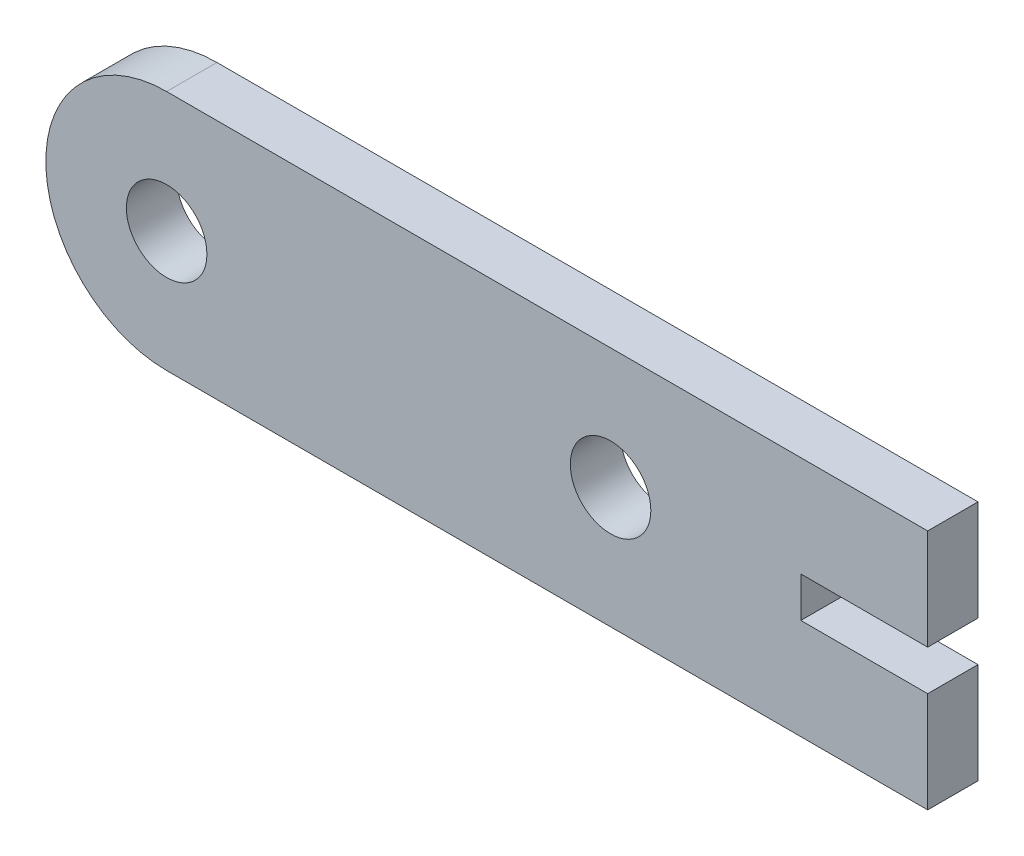
ISO-10303-21;
HEADER;
FILE_DESCRIPTION(('STEP AP214'),'2;1');
FILE_NAME('part.step','',(''),(''),'','','');
FILE_SCHEMA(('AUTOMOTIVE_DESIGN { 1 0 10303 214 1 1 1 1 }'));
ENDSEC;
DATA;
#1=APPLICATION_CONTEXT('core data for automotive mechanical design processes');
#2=APPLICATION_PROTOCOL_DEFINITION('international standard','automotive_design',2000,#1);
#3=PRODUCT_CONTEXT('',#1,'mechanical');
#4=PRODUCT('Part','Part','',(#3));
#5=PRODUCT_RELATED_PRODUCT_CATEGORY('part','',(#4));
#6=PRODUCT_DEFINITION_FORMATION('','',#4);
#7=PRODUCT_DEFINITION_CONTEXT('part definition',#1,'design');
#8=PRODUCT_DEFINITION('design','',#6,#7);
#9=PRODUCT_DEFINITION_SHAPE('','',#8);
#10=(LENGTH_UNIT() NAMED_UNIT(*) SI_UNIT(.MILLI.,.METRE.));
#11=(NAMED_UNIT(*) PLANE_ANGLE_UNIT() SI_UNIT($,.RADIAN.));
#12=(NAMED_UNIT(*) SI_UNIT($,.STERADIAN.) SOLID_ANGLE_UNIT());
#13=UNCERTAINTY_MEASURE_WITH_UNIT(LENGTH_MEASURE(1.E-05),#10,'distance_accuracy_value','');
#14=(GEOMETRIC_REPRESENTATION_CONTEXT(3) GLOBAL_UNCERTAINTY_ASSIGNED_CONTEXT((#13)) GLOBAL_UNIT_ASSIGNED_CONTEXT((#10,
#11,#12)) REPRESENTATION_CONTEXT('',''));
#15=CARTESIAN_POINT('',(0.,0.,0.));
#16=DIRECTION('',(0.,0.,1.));
#17=DIRECTION('',(1.,0.,0.));
#18=AXIS2_PLACEMENT_3D('',#15,#16,#17);
#19=CARTESIAN_POINT('',(0.,0.,7.9375));
#20=DIRECTION('',(0.,0.,1.));
#21=DIRECTION('',(1.,0.,0.));
#22=AXIS2_PLACEMENT_3D('',#19,#20,#21);
#23=PLANE('',#22);
#24=CARTESIAN_POINT('',(0.,0.,7.9375));
#25=DIRECTION('',(0.,0.,1.));
#26=DIRECTION('',(1.,0.,0.));
#27=AXIS2_PLACEMENT_3D('',#24,#25,#26);
#28=CIRCLE('',#27,6.35);
#29=CARTESIAN_POINT('',(6.35,0.,7.9375));
#30=VERTEX_POINT('',#29);
#31=EDGE_CURVE('E134',#30,#30,#28,.T.);
#32=ORIENTED_EDGE('',*,*,#31,.F.);
#33=EDGE_LOOP('',(#32));
#34=FACE_BOUND('',#33,.T.);
#35=CARTESIAN_POINT('',(0.,0.,7.9375));
#36=DIRECTION('',(0.,0.,1.));
#37=DIRECTION('',(1.,0.,0.));
#38=AXIS2_PLACEMENT_3D('',#35,#36,#37);
#39=CIRCLE('',#38,19.05);
#40=CARTESIAN_POINT('',(0.,19.05,7.9375));
#41=VERTEX_POINT('',#40);
#42=CARTESIAN_POINT('',(0.,-19.05,7.9375));
#43=VERTEX_POINT('',#42);
#44=EDGE_CURVE('E145',#41,#43,#39,.T.);
#45=ORIENTED_EDGE('',*,*,#44,.T.);
#46=DIRECTION('',(1.,0.,0.));
#47=VECTOR('',#46,1.);
#48=CARTESIAN_POINT('',(120.,-19.05,7.9375));
#49=LINE('',#48,#47);
#50=CARTESIAN_POINT('',(120.,-19.05,7.9375));
#51=VERTEX_POINT('',#50);
#52=EDGE_CURVE('E93',#43,#51,#49,.T.);
#53=ORIENTED_EDGE('',*,*,#52,.T.);
#54=DIRECTION('',(0.,1.,0.));
#55=VECTOR('',#54,1.);
#56=CARTESIAN_POINT('',(120.,-3.175,7.9375));
#57=LINE('',#56,#55);
#58=CARTESIAN_POINT('',(120.,-3.175,7.9375));
#59=VERTEX_POINT('',#58);
#60=EDGE_CURVE('E160',#51,#59,#57,.T.);
#61=ORIENTED_EDGE('',*,*,#60,.T.);
#62=DIRECTION('',(-1.,0.,0.));
#63=VECTOR('',#62,1.);
#64=CARTESIAN_POINT('',(100.,-3.175,7.9375));
#65=LINE('',#64,#63);
#66=CARTESIAN_POINT('',(100.,-3.175,7.9375));
#67=VERTEX_POINT('',#66);
#68=EDGE_CURVE('E173',#59,#67,#65,.T.);
#69=ORIENTED_EDGE('',*,*,#68,.T.);
#70=DIRECTION('',(0.,1.,0.));
#71=VECTOR('',#70,1.);
#72=CARTESIAN_POINT('',(100.,3.175,7.9375));
#73=LINE('',#72,#71);
#74=CARTESIAN_POINT('',(100.,3.175,7.9375));
#75=VERTEX_POINT('',#74);
#76=EDGE_CURVE('E112',#67,#75,#73,.T.);
#77=ORIENTED_EDGE('',*,*,#76,.T.);
#78=DIRECTION('',(1.,0.,0.));
#79=VECTOR('',#78,1.);
#80=CARTESIAN_POINT('',(120.,3.175,7.9375));
#81=LINE('',#80,#79);
#82=CARTESIAN_POINT('',(120.,3.175,7.9375));
#83=VERTEX_POINT('',#82);
#84=EDGE_CURVE('E106',#75,#83,#81,.T.);
#85=ORIENTED_EDGE('',*,*,#84,.T.);
#86=DIRECTION('',(0.,1.,0.));
#87=VECTOR('',#86,1.);
#88=CARTESIAN_POINT('',(120.,19.05,7.9375));
#89=LINE('',#88,#87);
#90=CARTESIAN_POINT('',(120.,19.05,7.9375));
#91=VERTEX_POINT('',#90);
#92=EDGE_CURVE('E110',#83,#91,#89,.T.);
#93=ORIENTED_EDGE('',*,*,#92,.T.);
#94=DIRECTION('',(-1.,0.,0.));
#95=VECTOR('',#94,1.);
#96=CARTESIAN_POINT('',(0.,19.05,7.9375));
#97=LINE('',#96,#95);
#98=EDGE_CURVE('E50',#91,#41,#97,.T.);
#99=ORIENTED_EDGE('',*,*,#98,.T.);
#100=EDGE_LOOP('',(#45,#53,#61,#69,#77,#85,#93,#99));
#101=FACE_BOUND('',#100,.T.);
#102=CARTESIAN_POINT('',(70.,0.,7.9375));
#103=DIRECTION('',(0.,0.,1.));
#104=DIRECTION('',(1.,0.,0.));
#105=AXIS2_PLACEMENT_3D('',#102,#103,#104);
#106=CIRCLE('',#105,6.35);
#107=CARTESIAN_POINT('',(76.35,0.,7.9375));
#108=VERTEX_POINT('',#107);
#109=EDGE_CURVE('E182',#108,#108,#106,.T.);
#110=ORIENTED_EDGE('',*,*,#109,.F.);
#111=EDGE_LOOP('',(#110));
#112=FACE_BOUND('',#111,.T.);
#113=ADVANCED_FACE('F33',(#34,#101,#112),#23,.T.);
#114=CARTESIAN_POINT('',(0.,0.,0.));
#115=DIRECTION('',(0.,0.,1.));
#116=DIRECTION('',(1.,0.,0.));
#117=AXIS2_PLACEMENT_3D('',#114,#115,#116);
#118=PLANE('',#117);
#119=CARTESIAN_POINT('',(0.,0.,0.));
#120=DIRECTION('',(0.,0.,1.));
#121=DIRECTION('',(1.,0.,0.));
#122=AXIS2_PLACEMENT_3D('',#119,#120,#121);
#123=CIRCLE('',#122,19.05);
#124=CARTESIAN_POINT('',(0.,19.05,0.));
#125=VERTEX_POINT('',#124);
#126=CARTESIAN_POINT('',(0.,-19.05,0.));
#127=VERTEX_POINT('',#126);
#128=EDGE_CURVE('E130',#125,#127,#123,.T.);
#129=ORIENTED_EDGE('',*,*,#128,.F.);
#130=DIRECTION('',(-1.,0.,0.));
#131=VECTOR('',#130,1.);
#132=CARTESIAN_POINT('',(0.,19.05,0.));
#133=LINE('',#132,#131);
#134=CARTESIAN_POINT('',(120.,19.05,0.));
#135=VERTEX_POINT('',#134);
#136=EDGE_CURVE('E85',#135,#125,#133,.T.);
#137=ORIENTED_EDGE('',*,*,#136,.F.);
#138=DIRECTION('',(0.,1.,0.));
#139=VECTOR('',#138,1.);
#140=CARTESIAN_POINT('',(120.,19.05,0.));
#141=LINE('',#140,#139);
#142=CARTESIAN_POINT('',(120.,3.175,0.));
#143=VERTEX_POINT('',#142);
#144=EDGE_CURVE('E79',#143,#135,#141,.T.);
#145=ORIENTED_EDGE('',*,*,#144,.F.);
#146=DIRECTION('',(1.,0.,0.));
#147=VECTOR('',#146,1.);
#148=CARTESIAN_POINT('',(120.,3.175,0.));
#149=LINE('',#148,#147);
#150=CARTESIAN_POINT('',(100.,3.175,0.));
#151=VERTEX_POINT('',#150);
#152=EDGE_CURVE('E120',#151,#143,#149,.T.);
#153=ORIENTED_EDGE('',*,*,#152,.F.);
#154=DIRECTION('',(0.,1.,0.));
#155=VECTOR('',#154,1.);
#156=CARTESIAN_POINT('',(100.,3.175,0.));
#157=LINE('',#156,#155);
#158=CARTESIAN_POINT('',(100.,-3.175,0.));
#159=VERTEX_POINT('',#158);
#160=EDGE_CURVE('E140',#159,#151,#157,.T.);
#161=ORIENTED_EDGE('',*,*,#160,.F.);
#162=DIRECTION('',(-1.,0.,0.));
#163=VECTOR('',#162,1.);
#164=CARTESIAN_POINT('',(100.,-3.175,0.));
#165=LINE('',#164,#163);
#166=CARTESIAN_POINT('',(120.,-3.175,0.));
#167=VERTEX_POINT('',#166);
#168=EDGE_CURVE('E138',#167,#159,#165,.T.);
#169=ORIENTED_EDGE('',*,*,#168,.F.);
#170=DIRECTION('',(0.,1.,0.));
#171=VECTOR('',#170,1.);
#172=CARTESIAN_POINT('',(120.,-3.175,0.));
#173=LINE('',#172,#171);
#174=CARTESIAN_POINT('',(120.,-19.05,0.));
#175=VERTEX_POINT('',#174);
#176=EDGE_CURVE('E136',#175,#167,#173,.T.);
#177=ORIENTED_EDGE('',*,*,#176,.F.);
#178=DIRECTION('',(1.,0.,0.));
#179=VECTOR('',#178,1.);
#180=CARTESIAN_POINT('',(120.,-19.05,0.));
#181=LINE('',#180,#179);
#182=EDGE_CURVE('E133',#127,#175,#181,.T.);
#183=ORIENTED_EDGE('',*,*,#182,.F.);
#184=EDGE_LOOP('',(#129,#137,#145,#153,#161,#169,#177,#183));
#185=FACE_BOUND('',#184,.T.);
#186=CARTESIAN_POINT('',(0.,0.,0.));
#187=DIRECTION('',(0.,0.,1.));
#188=DIRECTION('',(1.,0.,0.));
#189=AXIS2_PLACEMENT_3D('',#186,#187,#188);
#190=CIRCLE('',#189,6.35);
#191=CARTESIAN_POINT('',(6.35,0.,0.));
#192=VERTEX_POINT('',#191);
#193=EDGE_CURVE('E179',#192,#192,#190,.T.);
#194=ORIENTED_EDGE('',*,*,#193,.T.);
#195=EDGE_LOOP('',(#194));
#196=FACE_BOUND('',#195,.T.);
#197=CARTESIAN_POINT('',(70.,0.,0.));
#198=DIRECTION('',(0.,0.,1.));
#199=DIRECTION('',(1.,0.,0.));
#200=AXIS2_PLACEMENT_3D('',#197,#198,#199);
#201=CIRCLE('',#200,6.35);
#202=CARTESIAN_POINT('',(76.35,0.,0.));
#203=VERTEX_POINT('',#202);
#204=EDGE_CURVE('E185',#203,#203,#201,.T.);
#205=ORIENTED_EDGE('',*,*,#204,.T.);
#206=EDGE_LOOP('',(#205));
#207=FACE_BOUND('',#206,.T.);
#208=ADVANCED_FACE('F164',(#185,#196,#207),#118,.F.);
#209=CARTESIAN_POINT('',(0.,0.,7.9375));
#210=DIRECTION('',(0.,0.,-1.));
#211=DIRECTION('',(-1.,0.,0.));
#212=AXIS2_PLACEMENT_3D('',#209,#210,#211);
#213=CYLINDRICAL_SURFACE('',#212,19.05);
#214=ORIENTED_EDGE('',*,*,#128,.T.);
#215=DIRECTION('',(0.,0.,-1.));
#216=VECTOR('',#215,1.);
#217=CARTESIAN_POINT('',(0.,-19.05,7.9375));
#218=LINE('',#217,#216);
#219=EDGE_CURVE('E11',#43,#127,#218,.T.);
#220=ORIENTED_EDGE('',*,*,#219,.F.);
#221=ORIENTED_EDGE('',*,*,#44,.F.);
#222=DIRECTION('',(0.,0.,-1.));
#223=VECTOR('',#222,1.);
#224=CARTESIAN_POINT('',(0.,19.05,7.9375));
#225=LINE('',#224,#223);
#226=EDGE_CURVE('E126',#41,#125,#225,.T.);
#227=ORIENTED_EDGE('',*,*,#226,.T.);
#228=EDGE_LOOP('',(#214,#220,#221,#227));
#229=FACE_BOUND('',#228,.T.);
#230=ADVANCED_FACE('F35',(#229),#213,.T.);
#231=CARTESIAN_POINT('',(120.,-19.05,7.9375));
#232=DIRECTION('',(0.,1.,0.));
#233=DIRECTION('',(-1.,0.,0.));
#234=AXIS2_PLACEMENT_3D('',#231,#232,#233);
#235=PLANE('',#234);
#236=ORIENTED_EDGE('',*,*,#182,.T.);
#237=DIRECTION('',(0.,0.,-1.));
#238=VECTOR('',#237,1.);
#239=CARTESIAN_POINT('',(120.,-19.05,7.9375));
#240=LINE('',#239,#238);
#241=EDGE_CURVE('E42',#51,#175,#240,.T.);
#242=ORIENTED_EDGE('',*,*,#241,.F.);
#243=ORIENTED_EDGE('',*,*,#52,.F.);
#244=ORIENTED_EDGE('',*,*,#219,.T.);
#245=EDGE_LOOP('',(#236,#242,#243,#244));
#246=FACE_BOUND('',#245,.T.);
#247=ADVANCED_FACE('F217',(#246),#235,.F.);
#248=CARTESIAN_POINT('',(120.,-3.175,7.9375));
#249=DIRECTION('',(-1.,0.,0.));
#250=DIRECTION('',(0.,0.,1.));
#251=AXIS2_PLACEMENT_3D('',#248,#249,#250);
#252=PLANE('',#251);
#253=ORIENTED_EDGE('',*,*,#176,.T.);
#254=DIRECTION('',(0.,0.,-1.));
#255=VECTOR('',#254,1.);
#256=CARTESIAN_POINT('',(120.,-3.175,7.9375));
#257=LINE('',#256,#255);
#258=EDGE_CURVE('E152',#59,#167,#257,.T.);
#259=ORIENTED_EDGE('',*,*,#258,.F.);
#260=ORIENTED_EDGE('',*,*,#60,.F.);
#261=ORIENTED_EDGE('',*,*,#241,.T.);
#262=EDGE_LOOP('',(#253,#259,#260,#261));
#263=FACE_BOUND('',#262,.T.);
#264=ADVANCED_FACE('F158',(#263),#252,.F.);
#265=CARTESIAN_POINT('',(100.,-3.175,7.9375));
#266=DIRECTION('',(0.,-1.,0.));
#267=DIRECTION('',(1.,0.,0.));
#268=AXIS2_PLACEMENT_3D('',#265,#266,#267);
#269=PLANE('',#268);
#270=ORIENTED_EDGE('',*,*,#168,.T.);
#271=DIRECTION('',(0.,0.,-1.));
#272=VECTOR('',#271,1.);
#273=CARTESIAN_POINT('',(100.,-3.175,7.9375));
#274=LINE('',#273,#272);
#275=EDGE_CURVE('E149',#67,#159,#274,.T.);
#276=ORIENTED_EDGE('',*,*,#275,.F.);
#277=ORIENTED_EDGE('',*,*,#68,.F.);
#278=ORIENTED_EDGE('',*,*,#258,.T.);
#279=EDGE_LOOP('',(#270,#276,#277,#278));
#280=FACE_BOUND('',#279,.T.);
#281=ADVANCED_FACE('F169',(#280),#269,.F.);
#282=CARTESIAN_POINT('',(100.,3.175,7.9375));
#283=DIRECTION('',(-1.,0.,0.));
#284=DIRECTION('',(0.,0.,1.));
#285=AXIS2_PLACEMENT_3D('',#282,#283,#284);
#286=PLANE('',#285);
#287=ORIENTED_EDGE('',*,*,#160,.T.);
#288=DIRECTION('',(0.,0.,-1.));
#289=VECTOR('',#288,1.);
#290=CARTESIAN_POINT('',(100.,3.175,7.9375));
#291=LINE('',#290,#289);
#292=EDGE_CURVE('E121',#75,#151,#291,.T.);
#293=ORIENTED_EDGE('',*,*,#292,.F.);
#294=ORIENTED_EDGE('',*,*,#76,.F.);
#295=ORIENTED_EDGE('',*,*,#275,.T.);
#296=EDGE_LOOP('',(#287,#293,#294,#295));
#297=FACE_BOUND('',#296,.T.);
#298=ADVANCED_FACE('F172',(#297),#286,.F.);
#299=CARTESIAN_POINT('',(120.,3.175,7.9375));
#300=DIRECTION('',(0.,1.,0.));
#301=DIRECTION('',(-1.,0.,0.));
#302=AXIS2_PLACEMENT_3D('',#299,#300,#301);
#303=PLANE('',#302);
#304=ORIENTED_EDGE('',*,*,#152,.T.);
#305=DIRECTION('',(0.,0.,-1.));
#306=VECTOR('',#305,1.);
#307=CARTESIAN_POINT('',(120.,3.175,7.9375));
#308=LINE('',#307,#306);
#309=EDGE_CURVE('E117',#83,#143,#308,.T.);
#310=ORIENTED_EDGE('',*,*,#309,.F.);
#311=ORIENTED_EDGE('',*,*,#84,.F.);
#312=ORIENTED_EDGE('',*,*,#292,.T.);
#313=EDGE_LOOP('',(#304,#310,#311,#312));
#314=FACE_BOUND('',#313,.T.);
#315=ADVANCED_FACE('F118',(#314),#303,.F.);
#316=CARTESIAN_POINT('',(120.,19.05,7.9375));
#317=DIRECTION('',(-1.,0.,0.));
#318=DIRECTION('',(0.,0.,1.));
#319=AXIS2_PLACEMENT_3D('',#316,#317,#318);
#320=PLANE('',#319);
#321=ORIENTED_EDGE('',*,*,#144,.T.);
#322=DIRECTION('',(0.,0.,-1.));
#323=VECTOR('',#322,1.);
#324=CARTESIAN_POINT('',(120.,19.05,7.9375));
#325=LINE('',#324,#323);
#326=EDGE_CURVE('E122',#91,#135,#325,.T.);
#327=ORIENTED_EDGE('',*,*,#326,.F.);
#328=ORIENTED_EDGE('',*,*,#92,.F.);
#329=ORIENTED_EDGE('',*,*,#309,.T.);
#330=EDGE_LOOP('',(#321,#327,#328,#329));
#331=FACE_BOUND('',#330,.T.);
#332=ADVANCED_FACE('F124',(#331),#320,.F.);
#333=CARTESIAN_POINT('',(0.,19.05,7.9375));
#334=DIRECTION('',(0.,-1.,0.));
#335=DIRECTION('',(0.,0.,-1.));
#336=AXIS2_PLACEMENT_3D('',#333,#334,#335);
#337=PLANE('',#336);
#338=ORIENTED_EDGE('',*,*,#136,.T.);
#339=ORIENTED_EDGE('',*,*,#226,.F.);
#340=ORIENTED_EDGE('',*,*,#98,.F.);
#341=ORIENTED_EDGE('',*,*,#326,.T.);
#342=EDGE_LOOP('',(#338,#339,#340,#341));
#343=FACE_BOUND('',#342,.T.);
#344=ADVANCED_FACE('F205',(#343),#337,.F.);
#345=CARTESIAN_POINT('',(0.,0.,7.9375));
#346=DIRECTION('',(0.,0.,-1.));
#347=DIRECTION('',(-1.,0.,0.));
#348=AXIS2_PLACEMENT_3D('',#345,#346,#347);
#349=CYLINDRICAL_SURFACE('',#348,6.35);
#350=ORIENTED_EDGE('',*,*,#31,.T.);
#351=EDGE_LOOP('',(#350));
#352=FACE_BOUND('',#351,.T.);
#353=ORIENTED_EDGE('',*,*,#193,.F.);
#354=EDGE_LOOP('',(#353));
#355=FACE_BOUND('',#354,.T.);
#356=ADVANCED_FACE('F202',(#352,#355),#349,.F.);
#357=CARTESIAN_POINT('',(70.,0.,7.9375));
#358=DIRECTION('',(0.,0.,-1.));
#359=DIRECTION('',(-1.,0.,0.));
#360=AXIS2_PLACEMENT_3D('',#357,#358,#359);
#361=CYLINDRICAL_SURFACE('',#360,6.35);
#362=ORIENTED_EDGE('',*,*,#109,.T.);
#363=EDGE_LOOP('',(#362));
#364=FACE_BOUND('',#363,.T.);
#365=ORIENTED_EDGE('',*,*,#204,.F.);
#366=EDGE_LOOP('',(#365));
#367=FACE_BOUND('',#366,.T.);
#368=ADVANCED_FACE('F191',(#364,#367),#361,.F.);
#369=CLOSED_SHELL('',(#113,#208,#230,#247,#264,#281,#298,#315,#332,#344,#356,#368));
#370=MANIFOLD_SOLID_BREP('B2',#369);
#371=ADVANCED_BREP_SHAPE_REPRESENTATION('',(#18,#370),#14);
#372=SHAPE_DEFINITION_REPRESENTATION(#9,#371);
ENDSEC;
END-ISO-10303-21;
